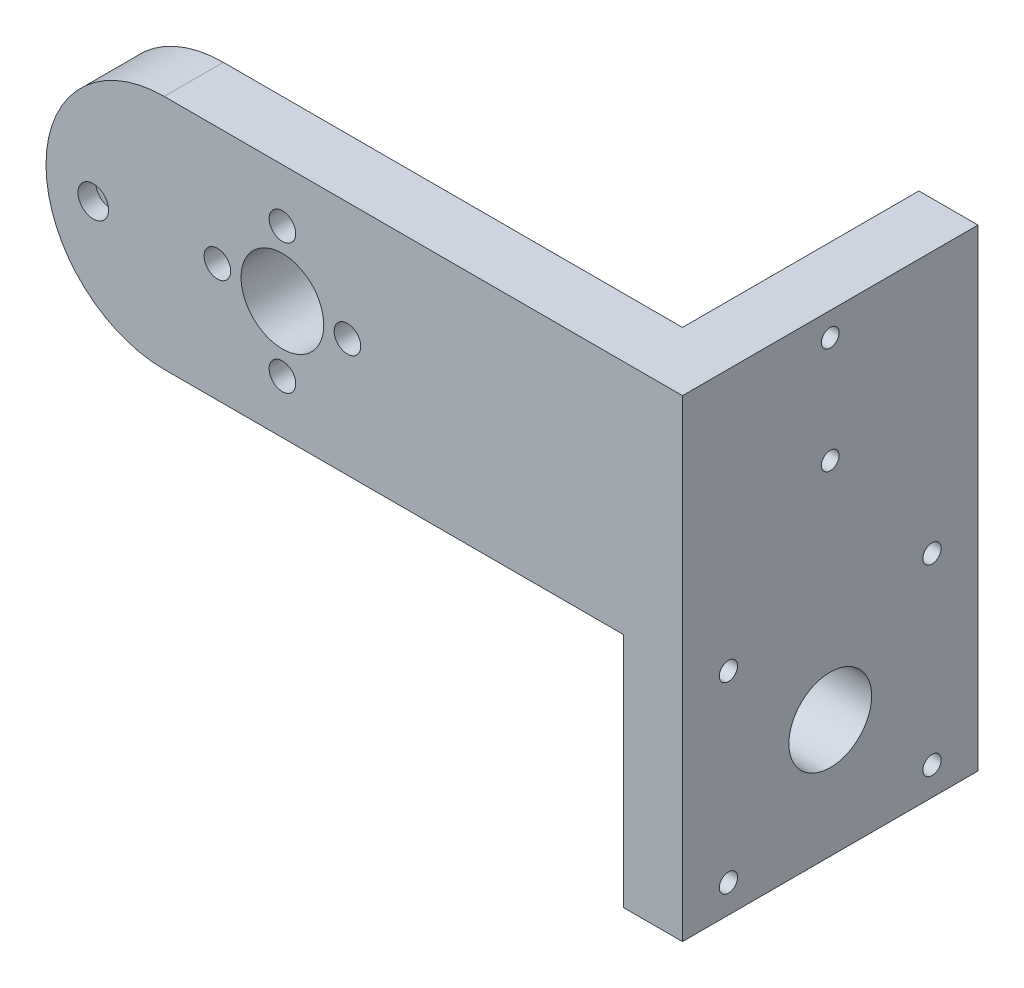
ISO-10303-21;
HEADER;
FILE_DESCRIPTION(('STEP AP214'),'2;1');
FILE_NAME('part.step','',(''),(''),'','','');
FILE_SCHEMA(('AUTOMOTIVE_DESIGN { 1 0 10303 214 1 1 1 1 }'));
ENDSEC;
DATA;
#1=APPLICATION_CONTEXT('core data for automotive mechanical design processes');
#2=APPLICATION_PROTOCOL_DEFINITION('international standard','automotive_design',2000,#1);
#3=PRODUCT_CONTEXT('',#1,'mechanical');
#4=PRODUCT('Part','Part','',(#3));
#5=PRODUCT_RELATED_PRODUCT_CATEGORY('part','',(#4));
#6=PRODUCT_DEFINITION_FORMATION('','',#4);
#7=PRODUCT_DEFINITION_CONTEXT('part definition',#1,'design');
#8=PRODUCT_DEFINITION('design','',#6,#7);
#9=PRODUCT_DEFINITION_SHAPE('','',#8);
#10=(LENGTH_UNIT() NAMED_UNIT(*) SI_UNIT(.MILLI.,.METRE.));
#11=(NAMED_UNIT(*) PLANE_ANGLE_UNIT() SI_UNIT($,.RADIAN.));
#12=(NAMED_UNIT(*) SI_UNIT($,.STERADIAN.) SOLID_ANGLE_UNIT());
#13=UNCERTAINTY_MEASURE_WITH_UNIT(LENGTH_MEASURE(1.E-05),#10,'distance_accuracy_value','');
#14=(GEOMETRIC_REPRESENTATION_CONTEXT(3) GLOBAL_UNCERTAINTY_ASSIGNED_CONTEXT((#13)) GLOBAL_UNIT_ASSIGNED_CONTEXT((#10,
#11,#12)) REPRESENTATION_CONTEXT('',''));
#15=CARTESIAN_POINT('',(0.,0.,0.));
#16=DIRECTION('',(0.,0.,1.));
#17=DIRECTION('',(1.,0.,0.));
#18=AXIS2_PLACEMENT_3D('',#15,#16,#17);
#19=CARTESIAN_POINT('',(0.,-20.,5.));
#20=DIRECTION('',(0.,1.,0.));
#21=DIRECTION('',(0.,0.,1.));
#22=AXIS2_PLACEMENT_3D('',#19,#20,#21);
#23=PLANE('',#22);
#24=DIRECTION('',(0.,0.,-1.));
#25=VECTOR('',#24,1.);
#26=CARTESIAN_POINT('',(77.69,-20.,5.));
#27=LINE('',#26,#25);
#28=CARTESIAN_POINT('',(77.69,-20.,5.));
#29=VERTEX_POINT('',#28);
#30=CARTESIAN_POINT('',(77.69,-20.,-5.));
#31=VERTEX_POINT('',#30);
#32=EDGE_CURVE('E63',#29,#31,#27,.T.);
#33=ORIENTED_EDGE('',*,*,#32,.F.);
#34=DIRECTION('',(1.,0.,0.));
#35=VECTOR('',#34,1.);
#36=CARTESIAN_POINT('',(0.,-20.,5.));
#37=LINE('',#36,#35);
#38=CARTESIAN_POINT('',(0.,-20.,5.));
#39=VERTEX_POINT('',#38);
#40=EDGE_CURVE('E89',#39,#29,#37,.T.);
#41=ORIENTED_EDGE('',*,*,#40,.F.);
#42=DIRECTION('',(0.,0.,-1.));
#43=VECTOR('',#42,1.);
#44=CARTESIAN_POINT('',(0.,-20.,5.));
#45=LINE('',#44,#43);
#46=CARTESIAN_POINT('',(0.,-20.,-5.));
#47=VERTEX_POINT('',#46);
#48=EDGE_CURVE('E55',#39,#47,#45,.T.);
#49=ORIENTED_EDGE('',*,*,#48,.T.);
#50=DIRECTION('',(1.,0.,0.));
#51=VECTOR('',#50,1.);
#52=CARTESIAN_POINT('',(0.,-20.,-5.));
#53=LINE('',#52,#51);
#54=EDGE_CURVE('E239',#47,#31,#53,.T.);
#55=ORIENTED_EDGE('',*,*,#54,.T.);
#56=EDGE_LOOP('',(#33,#41,#49,#55));
#57=FACE_BOUND('',#56,.T.);
#58=ADVANCED_FACE('F45',(#57),#23,.F.);
#59=CARTESIAN_POINT('',(0.,0.,-5.));
#60=DIRECTION('',(0.,0.,1.));
#61=DIRECTION('',(1.,0.,0.));
#62=AXIS2_PLACEMENT_3D('',#59,#60,#61);
#63=PLANE('',#62);
#64=CARTESIAN_POINT('',(20.,0.,-5.));
#65=DIRECTION('',(0.,0.,1.));
#66=DIRECTION('',(1.,0.,0.));
#67=AXIS2_PLACEMENT_3D('',#64,#65,#66);
#68=CIRCLE('',#67,7.);
#69=CARTESIAN_POINT('',(27.,0.,-5.));
#70=VERTEX_POINT('',#69);
#71=EDGE_CURVE('E220',#70,#70,#68,.T.);
#72=ORIENTED_EDGE('',*,*,#71,.T.);
#73=EDGE_LOOP('',(#72));
#74=FACE_BOUND('',#73,.T.);
#75=CARTESIAN_POINT('',(9.00000000000001,0.,-5.));
#76=DIRECTION('',(0.,0.,1.));
#77=DIRECTION('',(1.,0.,0.));
#78=AXIS2_PLACEMENT_3D('',#75,#76,#77);
#79=CIRCLE('',#78,2.25);
#80=CARTESIAN_POINT('',(11.25,0.,-5.));
#81=VERTEX_POINT('',#80);
#82=EDGE_CURVE('E197',#81,#81,#79,.T.);
#83=ORIENTED_EDGE('',*,*,#82,.T.);
#84=EDGE_LOOP('',(#83));
#85=FACE_BOUND('',#84,.T.);
#86=CARTESIAN_POINT('',(20.,-11.,-5.));
#87=DIRECTION('',(0.,0.,1.));
#88=DIRECTION('',(1.,0.,0.));
#89=AXIS2_PLACEMENT_3D('',#86,#87,#88);
#90=CIRCLE('',#89,2.25);
#91=CARTESIAN_POINT('',(22.25,-11.,-5.));
#92=VERTEX_POINT('',#91);
#93=EDGE_CURVE('E188',#92,#92,#90,.T.);
#94=ORIENTED_EDGE('',*,*,#93,.T.);
#95=EDGE_LOOP('',(#94));
#96=FACE_BOUND('',#95,.T.);
#97=CARTESIAN_POINT('',(31.,0.,-5.));
#98=DIRECTION('',(0.,0.,1.));
#99=DIRECTION('',(1.,0.,0.));
#100=AXIS2_PLACEMENT_3D('',#97,#98,#99);
#101=CIRCLE('',#100,2.25);
#102=CARTESIAN_POINT('',(33.25,0.,-5.));
#103=VERTEX_POINT('',#102);
#104=EDGE_CURVE('E213',#103,#103,#101,.T.);
#105=ORIENTED_EDGE('',*,*,#104,.T.);
#106=EDGE_LOOP('',(#105));
#107=FACE_BOUND('',#106,.T.);
#108=CARTESIAN_POINT('',(20.,11.,-5.));
#109=DIRECTION('',(0.,0.,1.));
#110=DIRECTION('',(1.,0.,0.));
#111=AXIS2_PLACEMENT_3D('',#108,#109,#110);
#112=CIRCLE('',#111,2.25);
#113=CARTESIAN_POINT('',(22.25,11.,-5.));
#114=VERTEX_POINT('',#113);
#115=EDGE_CURVE('E204',#114,#114,#112,.T.);
#116=ORIENTED_EDGE('',*,*,#115,.T.);
#117=EDGE_LOOP('',(#116));
#118=FACE_BOUND('',#117,.T.);
#119=DIRECTION('',(0.,1.,0.));
#120=VECTOR('',#119,1.);
#121=CARTESIAN_POINT('',(77.69,0.,-5.));
#122=LINE('',#121,#120);
#123=CARTESIAN_POINT('',(77.69,20.,-5.));
#124=VERTEX_POINT('',#123);
#125=EDGE_CURVE('E11',#31,#124,#122,.T.);
#126=ORIENTED_EDGE('',*,*,#125,.F.);
#127=ORIENTED_EDGE('',*,*,#54,.F.);
#128=CARTESIAN_POINT('',(0.,0.,-5.));
#129=DIRECTION('',(0.,0.,1.));
#130=DIRECTION('',(1.,0.,0.));
#131=AXIS2_PLACEMENT_3D('',#128,#129,#130);
#132=CIRCLE('',#131,20.);
#133=CARTESIAN_POINT('',(0.,20.,-5.));
#134=VERTEX_POINT('',#133);
#135=EDGE_CURVE('E224',#134,#47,#132,.T.);
#136=ORIENTED_EDGE('',*,*,#135,.F.);
#137=DIRECTION('',(-1.,0.,0.));
#138=VECTOR('',#137,1.);
#139=CARTESIAN_POINT('',(0.,20.,-5.));
#140=LINE('',#139,#138);
#141=EDGE_CURVE('E86',#124,#134,#140,.T.);
#142=ORIENTED_EDGE('',*,*,#141,.F.);
#143=EDGE_LOOP('',(#126,#127,#136,#142));
#144=FACE_BOUND('',#143,.T.);
#145=ADVANCED_FACE('F313',(#74,#85,#96,#107,#118,#144),#63,.F.);
#146=CARTESIAN_POINT('',(0.,0.,5.));
#147=DIRECTION('',(0.,0.,-1.));
#148=DIRECTION('',(-1.,0.,0.));
#149=AXIS2_PLACEMENT_3D('',#146,#147,#148);
#150=CYLINDRICAL_SURFACE('',#149,20.);
#151=ORIENTED_EDGE('',*,*,#135,.T.);
#152=ORIENTED_EDGE('',*,*,#48,.F.);
#153=CARTESIAN_POINT('',(0.,0.,5.));
#154=DIRECTION('',(0.,0.,1.));
#155=DIRECTION('',(1.,0.,0.));
#156=AXIS2_PLACEMENT_3D('',#153,#154,#155);
#157=CIRCLE('',#156,20.);
#158=CARTESIAN_POINT('',(0.,20.,5.));
#159=VERTEX_POINT('',#158);
#160=EDGE_CURVE('E228',#159,#39,#157,.T.);
#161=ORIENTED_EDGE('',*,*,#160,.F.);
#162=DIRECTION('',(0.,0.,-1.));
#163=VECTOR('',#162,1.);
#164=CARTESIAN_POINT('',(0.,20.,5.));
#165=LINE('',#164,#163);
#166=EDGE_CURVE('E235',#159,#134,#165,.T.);
#167=ORIENTED_EDGE('',*,*,#166,.T.);
#168=EDGE_LOOP('',(#151,#152,#161,#167));
#169=FACE_BOUND('',#168,.T.);
#170=ADVANCED_FACE('F47',(#169),#150,.T.);
#171=CARTESIAN_POINT('',(87.69,20.,5.));
#172=DIRECTION('',(-1.,0.,0.));
#173=DIRECTION('',(0.,0.,1.));
#174=AXIS2_PLACEMENT_3D('',#171,#172,#173);
#175=PLANE('',#174);
#176=CARTESIAN_POINT('',(87.69,-55.2235227874706,-2.78));
#177=DIRECTION('',(1.,0.,0.));
#178=DIRECTION('',(0.,0.,-1.));
#179=AXIS2_PLACEMENT_3D('',#176,#177,#178);
#180=CIRCLE('',#179,1.55);
#181=CARTESIAN_POINT('',(87.69,-55.2235227874706,-4.33000000000001));
#182=VERTEX_POINT('',#181);
#183=EDGE_CURVE('E400',#182,#182,#180,.T.);
#184=ORIENTED_EDGE('',*,*,#183,.F.);
#185=EDGE_LOOP('',(#184));
#186=FACE_BOUND('',#185,.T.);
#187=CARTESIAN_POINT('',(87.69,-55.2235227874706,-37.22));
#188=DIRECTION('',(1.,0.,0.));
#189=DIRECTION('',(0.,0.,-1.));
#190=AXIS2_PLACEMENT_3D('',#187,#188,#189);
#191=CIRCLE('',#190,1.55);
#192=CARTESIAN_POINT('',(87.69,-55.2235227874706,-38.77));
#193=VERTEX_POINT('',#192);
#194=EDGE_CURVE('E394',#193,#193,#191,.T.);
#195=ORIENTED_EDGE('',*,*,#194,.F.);
#196=EDGE_LOOP('',(#195));
#197=FACE_BOUND('',#196,.T.);
#198=CARTESIAN_POINT('',(87.69,-24.2235227874706,-37.22));
#199=DIRECTION('',(1.,0.,0.));
#200=DIRECTION('',(0.,0.,-1.));
#201=AXIS2_PLACEMENT_3D('',#198,#199,#200);
#202=CIRCLE('',#201,1.55);
#203=CARTESIAN_POINT('',(87.69,-24.2235227874706,-38.77));
#204=VERTEX_POINT('',#203);
#205=EDGE_CURVE('E381',#204,#204,#202,.T.);
#206=ORIENTED_EDGE('',*,*,#205,.F.);
#207=EDGE_LOOP('',(#206));
#208=FACE_BOUND('',#207,.T.);
#209=CARTESIAN_POINT('',(87.69,-24.2235227874706,-2.78));
#210=DIRECTION('',(1.,0.,0.));
#211=DIRECTION('',(0.,0.,-1.));
#212=AXIS2_PLACEMENT_3D('',#209,#210,#211);
#213=CIRCLE('',#212,1.55);
#214=CARTESIAN_POINT('',(87.69,-24.2235227874706,-4.33));
#215=VERTEX_POINT('',#214);
#216=EDGE_CURVE('E264',#215,#215,#213,.T.);
#217=ORIENTED_EDGE('',*,*,#216,.F.);
#218=EDGE_LOOP('',(#217));
#219=FACE_BOUND('',#218,.T.);
#220=CARTESIAN_POINT('',(87.69,-40.,-20.));
#221=DIRECTION('',(1.,0.,0.));
#222=DIRECTION('',(0.,0.,-1.));
#223=AXIS2_PLACEMENT_3D('',#220,#221,#222);
#224=CIRCLE('',#223,7.);
#225=CARTESIAN_POINT('',(87.69,-40.,-27.));
#226=VERTEX_POINT('',#225);
#227=EDGE_CURVE('E146',#226,#226,#224,.T.);
#228=ORIENTED_EDGE('',*,*,#227,.F.);
#229=EDGE_LOOP('',(#228));
#230=FACE_BOUND('',#229,.T.);
#231=CARTESIAN_POINT('',(87.69,16.,-20.));
#232=DIRECTION('',(1.,0.,0.));
#233=DIRECTION('',(0.,0.,-1.));
#234=AXIS2_PLACEMENT_3D('',#231,#232,#233);
#235=CIRCLE('',#234,1.5);
#236=CARTESIAN_POINT('',(87.69,16.,-21.5));
#237=VERTEX_POINT('',#236);
#238=EDGE_CURVE('E156',#237,#237,#235,.T.);
#239=ORIENTED_EDGE('',*,*,#238,.F.);
#240=EDGE_LOOP('',(#239));
#241=FACE_BOUND('',#240,.T.);
#242=CARTESIAN_POINT('',(87.69,-2.,-20.));
#243=DIRECTION('',(1.,0.,0.));
#244=DIRECTION('',(0.,0.,-1.));
#245=AXIS2_PLACEMENT_3D('',#242,#243,#244);
#246=CIRCLE('',#245,1.5);
#247=CARTESIAN_POINT('',(87.69,-2.,-21.5));
#248=VERTEX_POINT('',#247);
#249=EDGE_CURVE('E155',#248,#248,#246,.T.);
#250=ORIENTED_EDGE('',*,*,#249,.F.);
#251=EDGE_LOOP('',(#250));
#252=FACE_BOUND('',#251,.T.);
#253=DIRECTION('',(0.,1.,0.));
#254=VECTOR('',#253,1.);
#255=CARTESIAN_POINT('',(87.69,20.,5.));
#256=LINE('',#255,#254);
#257=CARTESIAN_POINT('',(87.69,-60.,5.));
#258=VERTEX_POINT('',#257);
#259=CARTESIAN_POINT('',(87.69,20.,5.));
#260=VERTEX_POINT('',#259);
#261=EDGE_CURVE('E115',#258,#260,#256,.T.);
#262=ORIENTED_EDGE('',*,*,#261,.F.);
#263=DIRECTION('',(0.,0.,1.));
#264=VECTOR('',#263,1.);
#265=CARTESIAN_POINT('',(87.69,-60.,5.));
#266=LINE('',#265,#264);
#267=CARTESIAN_POINT('',(87.69,-60.,-45.));
#268=VERTEX_POINT('',#267);
#269=EDGE_CURVE('E120',#268,#258,#266,.T.);
#270=ORIENTED_EDGE('',*,*,#269,.F.);
#271=DIRECTION('',(0.,1.,0.));
#272=VECTOR('',#271,1.);
#273=CARTESIAN_POINT('',(87.69,20.,-45.));
#274=LINE('',#273,#272);
#275=CARTESIAN_POINT('',(87.69,20.,-45.));
#276=VERTEX_POINT('',#275);
#277=EDGE_CURVE('E168',#268,#276,#274,.T.);
#278=ORIENTED_EDGE('',*,*,#277,.T.);
#279=DIRECTION('',(0.,0.,-1.));
#280=VECTOR('',#279,1.);
#281=CARTESIAN_POINT('',(87.69,20.,5.));
#282=LINE('',#281,#280);
#283=EDGE_CURVE('E121',#260,#276,#282,.T.);
#284=ORIENTED_EDGE('',*,*,#283,.F.);
#285=EDGE_LOOP('',(#262,#270,#278,#284));
#286=FACE_BOUND('',#285,.T.);
#287=ADVANCED_FACE('F117',(#186,#197,#208,#219,#230,#241,#252,#286),#175,.F.);
#288=CARTESIAN_POINT('',(0.,20.,5.));
#289=DIRECTION('',(0.,-1.,0.));
#290=DIRECTION('',(0.,0.,-1.));
#291=AXIS2_PLACEMENT_3D('',#288,#289,#290);
#292=PLANE('',#291);
#293=ORIENTED_EDGE('',*,*,#283,.T.);
#294=DIRECTION('',(1.,0.,0.));
#295=VECTOR('',#294,1.);
#296=CARTESIAN_POINT('',(77.69,20.,-45.));
#297=LINE('',#296,#295);
#298=CARTESIAN_POINT('',(77.69,20.,-45.));
#299=VERTEX_POINT('',#298);
#300=EDGE_CURVE('E181',#299,#276,#297,.T.);
#301=ORIENTED_EDGE('',*,*,#300,.F.);
#302=DIRECTION('',(0.,0.,1.));
#303=VECTOR('',#302,1.);
#304=CARTESIAN_POINT('',(77.69,20.,-5.));
#305=LINE('',#304,#303);
#306=EDGE_CURVE('E174',#299,#124,#305,.T.);
#307=ORIENTED_EDGE('',*,*,#306,.T.);
#308=ORIENTED_EDGE('',*,*,#141,.T.);
#309=ORIENTED_EDGE('',*,*,#166,.F.);
#310=DIRECTION('',(-1.,0.,0.));
#311=VECTOR('',#310,1.);
#312=CARTESIAN_POINT('',(0.,20.,5.));
#313=LINE('',#312,#311);
#314=EDGE_CURVE('E72',#260,#159,#313,.T.);
#315=ORIENTED_EDGE('',*,*,#314,.F.);
#316=EDGE_LOOP('',(#293,#301,#307,#308,#309,#315));
#317=FACE_BOUND('',#316,.T.);
#318=ADVANCED_FACE('F285',(#317),#292,.F.);
#319=CARTESIAN_POINT('',(0.,0.,5.));
#320=DIRECTION('',(0.,0.,1.));
#321=DIRECTION('',(1.,0.,0.));
#322=AXIS2_PLACEMENT_3D('',#319,#320,#321);
#323=PLANE('',#322);
#324=CARTESIAN_POINT('',(-12.,-1.375,5.));
#325=DIRECTION('',(0.,0.,1.));
#326=DIRECTION('',(1.,0.,0.));
#327=AXIS2_PLACEMENT_3D('',#324,#325,#326);
#328=CIRCLE('',#327,2.59);
#329=CARTESIAN_POINT('',(-9.41,-1.375,5.));
#330=VERTEX_POINT('',#329);
#331=EDGE_CURVE('E169',#330,#330,#328,.T.);
#332=ORIENTED_EDGE('',*,*,#331,.F.);
#333=EDGE_LOOP('',(#332));
#334=FACE_BOUND('',#333,.T.);
#335=ORIENTED_EDGE('',*,*,#314,.T.);
#336=ORIENTED_EDGE('',*,*,#160,.T.);
#337=ORIENTED_EDGE('',*,*,#40,.T.);
#338=DIRECTION('',(0.,1.,0.));
#339=VECTOR('',#338,1.);
#340=CARTESIAN_POINT('',(77.69,-60.,5.));
#341=LINE('',#340,#339);
#342=CARTESIAN_POINT('',(77.69,-60.,5.));
#343=VERTEX_POINT('',#342);
#344=EDGE_CURVE('E129',#343,#29,#341,.T.);
#345=ORIENTED_EDGE('',*,*,#344,.F.);
#346=DIRECTION('',(-1.,0.,0.));
#347=VECTOR('',#346,1.);
#348=CARTESIAN_POINT('',(87.69,-60.,5.));
#349=LINE('',#348,#347);
#350=EDGE_CURVE('E125',#258,#343,#349,.T.);
#351=ORIENTED_EDGE('',*,*,#350,.F.);
#352=ORIENTED_EDGE('',*,*,#261,.T.);
#353=EDGE_LOOP('',(#335,#336,#337,#345,#351,#352));
#354=FACE_BOUND('',#353,.T.);
#355=CARTESIAN_POINT('',(20.,11.,5.));
#356=DIRECTION('',(0.,0.,1.));
#357=DIRECTION('',(1.,0.,0.));
#358=AXIS2_PLACEMENT_3D('',#355,#356,#357);
#359=CIRCLE('',#358,2.25);
#360=CARTESIAN_POINT('',(22.25,11.,5.));
#361=VERTEX_POINT('',#360);
#362=EDGE_CURVE('E209',#361,#361,#359,.T.);
#363=ORIENTED_EDGE('',*,*,#362,.F.);
#364=EDGE_LOOP('',(#363));
#365=FACE_BOUND('',#364,.T.);
#366=CARTESIAN_POINT('',(31.,0.,5.));
#367=DIRECTION('',(0.,0.,1.));
#368=DIRECTION('',(1.,0.,0.));
#369=AXIS2_PLACEMENT_3D('',#366,#367,#368);
#370=CIRCLE('',#369,2.25);
#371=CARTESIAN_POINT('',(33.25,0.,5.));
#372=VERTEX_POINT('',#371);
#373=EDGE_CURVE('E192',#372,#372,#370,.T.);
#374=ORIENTED_EDGE('',*,*,#373,.F.);
#375=EDGE_LOOP('',(#374));
#376=FACE_BOUND('',#375,.T.);
#377=CARTESIAN_POINT('',(20.,-11.,5.));
#378=DIRECTION('',(0.,0.,1.));
#379=DIRECTION('',(1.,0.,0.));
#380=AXIS2_PLACEMENT_3D('',#377,#378,#379);
#381=CIRCLE('',#380,2.25);
#382=CARTESIAN_POINT('',(22.25,-11.,5.));
#383=VERTEX_POINT('',#382);
#384=EDGE_CURVE('E193',#383,#383,#381,.T.);
#385=ORIENTED_EDGE('',*,*,#384,.F.);
#386=EDGE_LOOP('',(#385));
#387=FACE_BOUND('',#386,.T.);
#388=CARTESIAN_POINT('',(9.00000000000001,0.,5.));
#389=DIRECTION('',(0.,0.,1.));
#390=DIRECTION('',(1.,0.,0.));
#391=AXIS2_PLACEMENT_3D('',#388,#389,#390);
#392=CIRCLE('',#391,2.25);
#393=CARTESIAN_POINT('',(11.25,0.,5.));
#394=VERTEX_POINT('',#393);
#395=EDGE_CURVE('E187',#394,#394,#392,.T.);
#396=ORIENTED_EDGE('',*,*,#395,.F.);
#397=EDGE_LOOP('',(#396));
#398=FACE_BOUND('',#397,.T.);
#399=CARTESIAN_POINT('',(20.,0.,5.));
#400=DIRECTION('',(0.,0.,1.));
#401=DIRECTION('',(1.,0.,0.));
#402=AXIS2_PLACEMENT_3D('',#399,#400,#401);
#403=CIRCLE('',#402,7.);
#404=CARTESIAN_POINT('',(27.,0.,5.));
#405=VERTEX_POINT('',#404);
#406=EDGE_CURVE('E208',#405,#405,#403,.T.);
#407=ORIENTED_EDGE('',*,*,#406,.F.);
#408=EDGE_LOOP('',(#407));
#409=FACE_BOUND('',#408,.T.);
#410=ADVANCED_FACE('F126',(#334,#354,#365,#376,#387,#398,#409),#323,.T.);
#411=CARTESIAN_POINT('',(20.,0.,-5.));
#412=DIRECTION('',(0.,0.,1.));
#413=DIRECTION('',(1.,0.,0.));
#414=AXIS2_PLACEMENT_3D('',#411,#412,#413);
#415=CYLINDRICAL_SURFACE('',#414,7.);
#416=ORIENTED_EDGE('',*,*,#71,.F.);
#417=EDGE_LOOP('',(#416));
#418=FACE_BOUND('',#417,.T.);
#419=ORIENTED_EDGE('',*,*,#406,.T.);
#420=EDGE_LOOP('',(#419));
#421=FACE_BOUND('',#420,.T.);
#422=ADVANCED_FACE('F326',(#418,#421),#415,.F.);
#423=CARTESIAN_POINT('',(9.00000000000001,0.,-5.));
#424=DIRECTION('',(0.,0.,1.));
#425=DIRECTION('',(1.,0.,0.));
#426=AXIS2_PLACEMENT_3D('',#423,#424,#425);
#427=CYLINDRICAL_SURFACE('',#426,2.25);
#428=ORIENTED_EDGE('',*,*,#82,.F.);
#429=EDGE_LOOP('',(#428));
#430=FACE_BOUND('',#429,.T.);
#431=ORIENTED_EDGE('',*,*,#395,.T.);
#432=EDGE_LOOP('',(#431));
#433=FACE_BOUND('',#432,.T.);
#434=ADVANCED_FACE('F330',(#430,#433),#427,.F.);
#435=CARTESIAN_POINT('',(20.,-11.,-5.));
#436=DIRECTION('',(0.,0.,1.));
#437=DIRECTION('',(1.,0.,0.));
#438=AXIS2_PLACEMENT_3D('',#435,#436,#437);
#439=CYLINDRICAL_SURFACE('',#438,2.25);
#440=ORIENTED_EDGE('',*,*,#93,.F.);
#441=EDGE_LOOP('',(#440));
#442=FACE_BOUND('',#441,.T.);
#443=ORIENTED_EDGE('',*,*,#384,.T.);
#444=EDGE_LOOP('',(#443));
#445=FACE_BOUND('',#444,.T.);
#446=ADVANCED_FACE('F335',(#442,#445),#439,.F.);
#447=CARTESIAN_POINT('',(31.,0.,-5.));
#448=DIRECTION('',(0.,0.,1.));
#449=DIRECTION('',(1.,0.,0.));
#450=AXIS2_PLACEMENT_3D('',#447,#448,#449);
#451=CYLINDRICAL_SURFACE('',#450,2.25);
#452=ORIENTED_EDGE('',*,*,#104,.F.);
#453=EDGE_LOOP('',(#452));
#454=FACE_BOUND('',#453,.T.);
#455=ORIENTED_EDGE('',*,*,#373,.T.);
#456=EDGE_LOOP('',(#455));
#457=FACE_BOUND('',#456,.T.);
#458=ADVANCED_FACE('F332',(#454,#457),#451,.F.);
#459=CARTESIAN_POINT('',(20.,11.,-5.));
#460=DIRECTION('',(0.,0.,1.));
#461=DIRECTION('',(1.,0.,0.));
#462=AXIS2_PLACEMENT_3D('',#459,#460,#461);
#463=CYLINDRICAL_SURFACE('',#462,2.25);
#464=ORIENTED_EDGE('',*,*,#115,.F.);
#465=EDGE_LOOP('',(#464));
#466=FACE_BOUND('',#465,.T.);
#467=ORIENTED_EDGE('',*,*,#362,.T.);
#468=EDGE_LOOP('',(#467));
#469=FACE_BOUND('',#468,.T.);
#470=ADVANCED_FACE('F304',(#466,#469),#463,.F.);
#471=CARTESIAN_POINT('',(77.69,0.,0.));
#472=DIRECTION('',(1.,0.,0.));
#473=DIRECTION('',(0.,0.,-1.));
#474=AXIS2_PLACEMENT_3D('',#471,#472,#473);
#475=PLANE('',#474);
#476=CARTESIAN_POINT('',(77.69,-55.2235227874706,-2.78));
#477=DIRECTION('',(1.,0.,0.));
#478=DIRECTION('',(0.,0.,-1.));
#479=AXIS2_PLACEMENT_3D('',#476,#477,#478);
#480=CIRCLE('',#479,1.55);
#481=CARTESIAN_POINT('',(77.69,-55.2235227874706,-4.33000000000001));
#482=VERTEX_POINT('',#481);
#483=EDGE_CURVE('E49',#482,#482,#480,.T.);
#484=ORIENTED_EDGE('',*,*,#483,.T.);
#485=EDGE_LOOP('',(#484));
#486=FACE_BOUND('',#485,.T.);
#487=CARTESIAN_POINT('',(77.69,-55.2235227874706,-37.22));
#488=DIRECTION('',(1.,0.,0.));
#489=DIRECTION('',(0.,0.,-1.));
#490=AXIS2_PLACEMENT_3D('',#487,#488,#489);
#491=CIRCLE('',#490,1.55);
#492=CARTESIAN_POINT('',(77.69,-55.2235227874706,-38.77));
#493=VERTEX_POINT('',#492);
#494=EDGE_CURVE('E267',#493,#493,#491,.T.);
#495=ORIENTED_EDGE('',*,*,#494,.T.);
#496=EDGE_LOOP('',(#495));
#497=FACE_BOUND('',#496,.T.);
#498=CARTESIAN_POINT('',(77.69,-24.2235227874706,-37.22));
#499=DIRECTION('',(1.,0.,0.));
#500=DIRECTION('',(0.,0.,-1.));
#501=AXIS2_PLACEMENT_3D('',#498,#499,#500);
#502=CIRCLE('',#501,1.55);
#503=CARTESIAN_POINT('',(77.69,-24.2235227874706,-38.77));
#504=VERTEX_POINT('',#503);
#505=EDGE_CURVE('E263',#504,#504,#502,.T.);
#506=ORIENTED_EDGE('',*,*,#505,.T.);
#507=EDGE_LOOP('',(#506));
#508=FACE_BOUND('',#507,.T.);
#509=CARTESIAN_POINT('',(77.69,-24.2235227874706,-2.78));
#510=DIRECTION('',(1.,0.,0.));
#511=DIRECTION('',(0.,0.,-1.));
#512=AXIS2_PLACEMENT_3D('',#509,#510,#511);
#513=CIRCLE('',#512,1.55);
#514=CARTESIAN_POINT('',(77.69,-24.2235227874706,-4.33));
#515=VERTEX_POINT('',#514);
#516=EDGE_CURVE('E259',#515,#515,#513,.T.);
#517=ORIENTED_EDGE('',*,*,#516,.T.);
#518=EDGE_LOOP('',(#517));
#519=FACE_BOUND('',#518,.T.);
#520=CARTESIAN_POINT('',(77.69,-40.,-20.));
#521=DIRECTION('',(1.,0.,0.));
#522=DIRECTION('',(0.,0.,-1.));
#523=AXIS2_PLACEMENT_3D('',#520,#521,#522);
#524=CIRCLE('',#523,7.);
#525=CARTESIAN_POINT('',(77.69,-40.,-27.));
#526=VERTEX_POINT('',#525);
#527=EDGE_CURVE('E143',#526,#526,#524,.T.);
#528=ORIENTED_EDGE('',*,*,#527,.T.);
#529=EDGE_LOOP('',(#528));
#530=FACE_BOUND('',#529,.T.);
#531=CARTESIAN_POINT('',(77.69,16.,-20.));
#532=DIRECTION('',(1.,0.,0.));
#533=DIRECTION('',(0.,0.,-1.));
#534=AXIS2_PLACEMENT_3D('',#531,#532,#533);
#535=CIRCLE('',#534,1.5);
#536=CARTESIAN_POINT('',(77.69,16.,-21.5));
#537=VERTEX_POINT('',#536);
#538=EDGE_CURVE('E173',#537,#537,#535,.T.);
#539=ORIENTED_EDGE('',*,*,#538,.T.);
#540=EDGE_LOOP('',(#539));
#541=FACE_BOUND('',#540,.T.);
#542=CARTESIAN_POINT('',(77.69,-2.,-20.));
#543=DIRECTION('',(1.,0.,0.));
#544=DIRECTION('',(0.,0.,-1.));
#545=AXIS2_PLACEMENT_3D('',#542,#543,#544);
#546=CIRCLE('',#545,1.5);
#547=CARTESIAN_POINT('',(77.69,-2.,-21.5));
#548=VERTEX_POINT('',#547);
#549=EDGE_CURVE('E160',#548,#548,#546,.T.);
#550=ORIENTED_EDGE('',*,*,#549,.T.);
#551=EDGE_LOOP('',(#550));
#552=FACE_BOUND('',#551,.T.);
#553=DIRECTION('',(0.,1.,0.));
#554=VECTOR('',#553,1.);
#555=CARTESIAN_POINT('',(77.69,20.,-45.));
#556=LINE('',#555,#554);
#557=CARTESIAN_POINT('',(77.69,-60.,-45.));
#558=VERTEX_POINT('',#557);
#559=EDGE_CURVE('E177',#558,#299,#556,.T.);
#560=ORIENTED_EDGE('',*,*,#559,.F.);
#561=DIRECTION('',(0.,0.,-1.));
#562=VECTOR('',#561,1.);
#563=CARTESIAN_POINT('',(77.69,-60.,5.));
#564=LINE('',#563,#562);
#565=EDGE_CURVE('E134',#343,#558,#564,.T.);
#566=ORIENTED_EDGE('',*,*,#565,.F.);
#567=ORIENTED_EDGE('',*,*,#344,.T.);
#568=ORIENTED_EDGE('',*,*,#32,.T.);
#569=ORIENTED_EDGE('',*,*,#125,.T.);
#570=ORIENTED_EDGE('',*,*,#306,.F.);
#571=EDGE_LOOP('',(#560,#566,#567,#568,#569,#570));
#572=FACE_BOUND('',#571,.T.);
#573=ADVANCED_FACE('F300',(#486,#497,#508,#519,#530,#541,#552,#572),#475,.F.);
#574=CARTESIAN_POINT('',(77.69,20.,-45.));
#575=DIRECTION('',(0.,0.,-1.));
#576=DIRECTION('',(0.,1.,0.));
#577=AXIS2_PLACEMENT_3D('',#574,#575,#576);
#578=PLANE('',#577);
#579=ORIENTED_EDGE('',*,*,#277,.F.);
#580=DIRECTION('',(1.,0.,0.));
#581=VECTOR('',#580,1.);
#582=CARTESIAN_POINT('',(87.69,-60.,-45.));
#583=LINE('',#582,#581);
#584=EDGE_CURVE('E139',#558,#268,#583,.T.);
#585=ORIENTED_EDGE('',*,*,#584,.F.);
#586=ORIENTED_EDGE('',*,*,#559,.T.);
#587=ORIENTED_EDGE('',*,*,#300,.T.);
#588=EDGE_LOOP('',(#579,#585,#586,#587));
#589=FACE_BOUND('',#588,.T.);
#590=ADVANCED_FACE('F303',(#589),#578,.T.);
#591=CARTESIAN_POINT('',(-12.,-1.375,2.));
#592=DIRECTION('',(0.,0.,1.));
#593=DIRECTION('',(1.,0.,0.));
#594=AXIS2_PLACEMENT_3D('',#591,#592,#593);
#595=CYLINDRICAL_SURFACE('',#594,2.59);
#596=CARTESIAN_POINT('',(-12.,-1.375,2.));
#597=DIRECTION('',(0.,0.,1.));
#598=DIRECTION('',(1.,0.,0.));
#599=AXIS2_PLACEMENT_3D('',#596,#597,#598);
#600=CIRCLE('',#599,2.59);
#601=CARTESIAN_POINT('',(-9.41,-1.375,2.));
#602=VERTEX_POINT('',#601);
#603=EDGE_CURVE('E164',#602,#602,#600,.T.);
#604=ORIENTED_EDGE('',*,*,#603,.F.);
#605=EDGE_LOOP('',(#604));
#606=FACE_BOUND('',#605,.T.);
#607=ORIENTED_EDGE('',*,*,#331,.T.);
#608=EDGE_LOOP('',(#607));
#609=FACE_BOUND('',#608,.T.);
#610=ADVANCED_FACE('F347',(#606,#609),#595,.F.);
#611=CARTESIAN_POINT('',(-12.,-1.375,2.));
#612=DIRECTION('',(0.,0.,1.));
#613=DIRECTION('',(1.,0.,0.));
#614=AXIS2_PLACEMENT_3D('',#611,#612,#613);
#615=PLANE('',#614);
#616=ORIENTED_EDGE('',*,*,#603,.T.);
#617=EDGE_LOOP('',(#616));
#618=FACE_BOUND('',#617,.T.);
#619=ADVANCED_FACE('F296',(#618),#615,.T.);
#620=CARTESIAN_POINT('',(-20.,-2.,-20.));
#621=DIRECTION('',(1.,0.,0.));
#622=DIRECTION('',(0.,0.,-1.));
#623=AXIS2_PLACEMENT_3D('',#620,#621,#622);
#624=CYLINDRICAL_SURFACE('',#623,1.5);
#625=ORIENTED_EDGE('',*,*,#249,.T.);
#626=EDGE_LOOP('',(#625));
#627=FACE_BOUND('',#626,.T.);
#628=ORIENTED_EDGE('',*,*,#549,.F.);
#629=EDGE_LOOP('',(#628));
#630=FACE_BOUND('',#629,.T.);
#631=ADVANCED_FACE('F292',(#627,#630),#624,.F.);
#632=CARTESIAN_POINT('',(-20.,16.,-20.));
#633=DIRECTION('',(1.,0.,0.));
#634=DIRECTION('',(0.,0.,-1.));
#635=AXIS2_PLACEMENT_3D('',#632,#633,#634);
#636=CYLINDRICAL_SURFACE('',#635,1.5);
#637=ORIENTED_EDGE('',*,*,#238,.T.);
#638=EDGE_LOOP('',(#637));
#639=FACE_BOUND('',#638,.T.);
#640=ORIENTED_EDGE('',*,*,#538,.F.);
#641=EDGE_LOOP('',(#640));
#642=FACE_BOUND('',#641,.T.);
#643=ADVANCED_FACE('F295',(#639,#642),#636,.F.);
#644=CARTESIAN_POINT('',(0.,-60.,0.));
#645=DIRECTION('',(0.,1.,0.));
#646=DIRECTION('',(0.,0.,1.));
#647=AXIS2_PLACEMENT_3D('',#644,#645,#646);
#648=PLANE('',#647);
#649=ORIENTED_EDGE('',*,*,#269,.T.);
#650=ORIENTED_EDGE('',*,*,#350,.T.);
#651=ORIENTED_EDGE('',*,*,#565,.T.);
#652=ORIENTED_EDGE('',*,*,#584,.T.);
#653=EDGE_LOOP('',(#649,#650,#651,#652));
#654=FACE_BOUND('',#653,.T.);
#655=ADVANCED_FACE('F137',(#654),#648,.F.);
#656=CARTESIAN_POINT('',(-20.,-40.,-20.));
#657=DIRECTION('',(1.,0.,0.));
#658=DIRECTION('',(0.,0.,-1.));
#659=AXIS2_PLACEMENT_3D('',#656,#657,#658);
#660=CYLINDRICAL_SURFACE('',#659,7.);
#661=ORIENTED_EDGE('',*,*,#227,.T.);
#662=EDGE_LOOP('',(#661));
#663=FACE_BOUND('',#662,.T.);
#664=ORIENTED_EDGE('',*,*,#527,.F.);
#665=EDGE_LOOP('',(#664));
#666=FACE_BOUND('',#665,.T.);
#667=ADVANCED_FACE('F280',(#663,#666),#660,.F.);
#668=CARTESIAN_POINT('',(-20.,-24.2235227874706,-2.78));
#669=DIRECTION('',(1.,0.,0.));
#670=DIRECTION('',(0.,0.,-1.));
#671=AXIS2_PLACEMENT_3D('',#668,#669,#670);
#672=CYLINDRICAL_SURFACE('',#671,1.55);
#673=ORIENTED_EDGE('',*,*,#216,.T.);
#674=EDGE_LOOP('',(#673));
#675=FACE_BOUND('',#674,.T.);
#676=ORIENTED_EDGE('',*,*,#516,.F.);
#677=EDGE_LOOP('',(#676));
#678=FACE_BOUND('',#677,.T.);
#679=ADVANCED_FACE('F361',(#675,#678),#672,.F.);
#680=CARTESIAN_POINT('',(-20.,-24.2235227874706,-37.22));
#681=DIRECTION('',(1.,0.,0.));
#682=DIRECTION('',(0.,0.,-1.));
#683=AXIS2_PLACEMENT_3D('',#680,#681,#682);
#684=CYLINDRICAL_SURFACE('',#683,1.55);
#685=ORIENTED_EDGE('',*,*,#205,.T.);
#686=EDGE_LOOP('',(#685));
#687=FACE_BOUND('',#686,.T.);
#688=ORIENTED_EDGE('',*,*,#505,.F.);
#689=EDGE_LOOP('',(#688));
#690=FACE_BOUND('',#689,.T.);
#691=ADVANCED_FACE('F364',(#687,#690),#684,.F.);
#692=CARTESIAN_POINT('',(-20.,-55.2235227874706,-37.22));
#693=DIRECTION('',(1.,0.,0.));
#694=DIRECTION('',(0.,0.,-1.));
#695=AXIS2_PLACEMENT_3D('',#692,#693,#694);
#696=CYLINDRICAL_SURFACE('',#695,1.55);
#697=ORIENTED_EDGE('',*,*,#194,.T.);
#698=EDGE_LOOP('',(#697));
#699=FACE_BOUND('',#698,.T.);
#700=ORIENTED_EDGE('',*,*,#494,.F.);
#701=EDGE_LOOP('',(#700));
#702=FACE_BOUND('',#701,.T.);
#703=ADVANCED_FACE('F369',(#699,#702),#696,.F.);
#704=CARTESIAN_POINT('',(-20.,-55.2235227874706,-2.78));
#705=DIRECTION('',(1.,0.,0.));
#706=DIRECTION('',(0.,0.,-1.));
#707=AXIS2_PLACEMENT_3D('',#704,#705,#706);
#708=CYLINDRICAL_SURFACE('',#707,1.55);
#709=ORIENTED_EDGE('',*,*,#183,.T.);
#710=EDGE_LOOP('',(#709));
#711=FACE_BOUND('',#710,.T.);
#712=ORIENTED_EDGE('',*,*,#483,.F.);
#713=EDGE_LOOP('',(#712));
#714=FACE_BOUND('',#713,.T.);
#715=ADVANCED_FACE('F366',(#711,#714),#708,.F.);
#716=CLOSED_SHELL('',(#58,#145,#170,#287,#318,#410,#422,#434,#446,#458,#470,#573,#590,#610,#619,
#631,#643,#655,#667,#679,#691,#703,#715));
#717=MANIFOLD_SOLID_BREP('B2',#716);
#718=ADVANCED_BREP_SHAPE_REPRESENTATION('',(#18,#717),#14);
#719=SHAPE_DEFINITION_REPRESENTATION(#9,#718);
ENDSEC;
END-ISO-10303-21;
